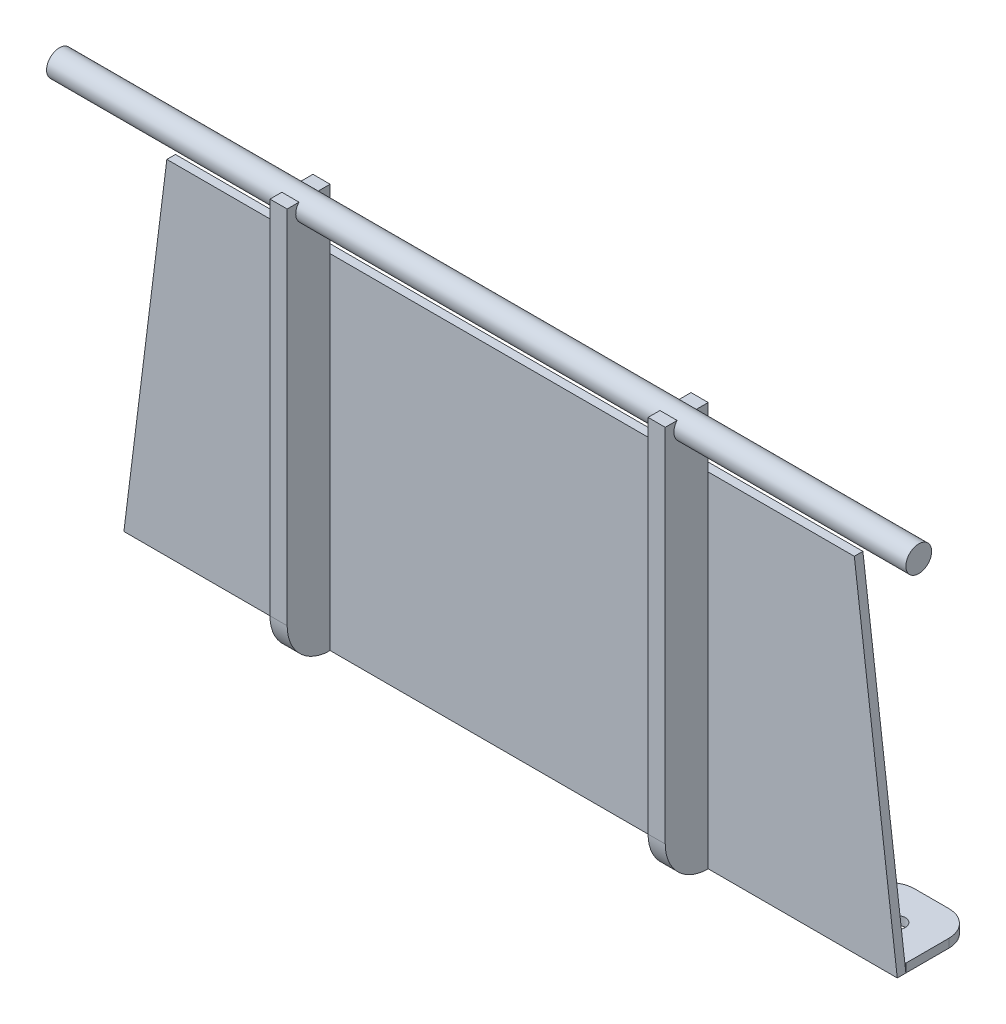
ISO-10303-21;
HEADER;
FILE_DESCRIPTION(('STEP AP214'),'2;1');
FILE_NAME('part.step','',(''),(''),'','','');
FILE_SCHEMA(('AUTOMOTIVE_DESIGN { 1 0 10303 214 1 1 1 1 }'));
ENDSEC;
DATA;
#1=APPLICATION_CONTEXT('core data for automotive mechanical design processes');
#2=APPLICATION_PROTOCOL_DEFINITION('international standard','automotive_design',2000,#1);
#3=PRODUCT_CONTEXT('',#1,'mechanical');
#4=PRODUCT('Part','Part','',(#3));
#5=PRODUCT_RELATED_PRODUCT_CATEGORY('part','',(#4));
#6=PRODUCT_DEFINITION_FORMATION('','',#4);
#7=PRODUCT_DEFINITION_CONTEXT('part definition',#1,'design');
#8=PRODUCT_DEFINITION('design','',#6,#7);
#9=PRODUCT_DEFINITION_SHAPE('','',#8);
#10=(LENGTH_UNIT() NAMED_UNIT(*) SI_UNIT(.MILLI.,.METRE.));
#11=(NAMED_UNIT(*) PLANE_ANGLE_UNIT() SI_UNIT($,.RADIAN.));
#12=(NAMED_UNIT(*) SI_UNIT($,.STERADIAN.) SOLID_ANGLE_UNIT());
#13=UNCERTAINTY_MEASURE_WITH_UNIT(LENGTH_MEASURE(1.E-05),#10,'distance_accuracy_value','');
#14=(GEOMETRIC_REPRESENTATION_CONTEXT(3) GLOBAL_UNCERTAINTY_ASSIGNED_CONTEXT((#13)) GLOBAL_UNIT_ASSIGNED_CONTEXT((#10,
#11,#12)) REPRESENTATION_CONTEXT('',''));
#15=CARTESIAN_POINT('',(0.,0.,0.));
#16=DIRECTION('',(0.,0.,1.));
#17=DIRECTION('',(1.,0.,0.));
#18=AXIS2_PLACEMENT_3D('',#15,#16,#17);
#19=CARTESIAN_POINT('',(0.,0.,0.));
#20=DIRECTION('',(0.,0.,1.));
#21=DIRECTION('',(1.,0.,0.));
#22=AXIS2_PLACEMENT_3D('',#19,#20,#21);
#23=PLANE('',#22);
#24=DIRECTION('',(-1.,0.,0.));
#25=VECTOR('',#24,1.);
#26=CARTESIAN_POINT('',(35.,1.,0.));
#27=LINE('',#26,#25);
#28=CARTESIAN_POINT('',(44.875,1.00000000000001,0.));
#29=VERTEX_POINT('',#28);
#30=CARTESIAN_POINT('',(35.,1.,0.));
#31=VERTEX_POINT('',#30);
#32=EDGE_CURVE('E249',#29,#31,#27,.T.);
#33=ORIENTED_EDGE('',*,*,#32,.T.);
#34=DIRECTION('',(0.,-1.,0.));
#35=VECTOR('',#34,1.);
#36=CARTESIAN_POINT('',(35.,1.,0.));
#37=LINE('',#36,#35);
#38=CARTESIAN_POINT('',(35.,0.,0.));
#39=VERTEX_POINT('',#38);
#40=EDGE_CURVE('E244',#31,#39,#37,.T.);
#41=ORIENTED_EDGE('',*,*,#40,.T.);
#42=DIRECTION('',(1.,0.,0.));
#43=VECTOR('',#42,1.);
#44=CARTESIAN_POINT('',(-45.,0.,0.));
#45=LINE('',#44,#43);
#46=CARTESIAN_POINT('',(-35.,0.,0.));
#47=VERTEX_POINT('',#46);
#48=EDGE_CURVE('E400',#47,#39,#45,.T.);
#49=ORIENTED_EDGE('',*,*,#48,.F.);
#50=DIRECTION('',(0.,-1.,0.));
#51=VECTOR('',#50,1.);
#52=CARTESIAN_POINT('',(-35.,1.,0.));
#53=LINE('',#52,#51);
#54=CARTESIAN_POINT('',(-35.,1.,0.));
#55=VERTEX_POINT('',#54);
#56=EDGE_CURVE('E299',#55,#47,#53,.T.);
#57=ORIENTED_EDGE('',*,*,#56,.F.);
#58=DIRECTION('',(1.,0.,0.));
#59=VECTOR('',#58,1.);
#60=CARTESIAN_POINT('',(-35.,1.,0.));
#61=LINE('',#60,#59);
#62=CARTESIAN_POINT('',(-44.875,1.,0.));
#63=VERTEX_POINT('',#62);
#64=EDGE_CURVE('E282',#63,#55,#61,.T.);
#65=ORIENTED_EDGE('',*,*,#64,.F.);
#66=DIRECTION('',(-0.124034734589208,-0.992277876713668,0.));
#67=VECTOR('',#66,1.);
#68=CARTESIAN_POINT('',(-40.,40.,0.));
#69=LINE('',#68,#67);
#70=CARTESIAN_POINT('',(-40.,40.,0.));
#71=VERTEX_POINT('',#70);
#72=EDGE_CURVE('E397',#71,#63,#69,.T.);
#73=ORIENTED_EDGE('',*,*,#72,.F.);
#74=DIRECTION('',(-1.,0.,0.));
#75=VECTOR('',#74,1.);
#76=CARTESIAN_POINT('',(40.,40.,0.));
#77=LINE('',#76,#75);
#78=CARTESIAN_POINT('',(40.,40.,0.));
#79=VERTEX_POINT('',#78);
#80=EDGE_CURVE('E385',#79,#71,#77,.T.);
#81=ORIENTED_EDGE('',*,*,#80,.F.);
#82=DIRECTION('',(-0.124034734589208,0.992277876713668,0.));
#83=VECTOR('',#82,1.);
#84=CARTESIAN_POINT('',(40.,40.,0.));
#85=LINE('',#84,#83);
#86=EDGE_CURVE('E403',#29,#79,#85,.T.);
#87=ORIENTED_EDGE('',*,*,#86,.F.);
#88=EDGE_LOOP('',(#33,#41,#49,#57,#65,#73,#81,#87));
#89=FACE_BOUND('',#88,.T.);
#90=ADVANCED_FACE('F33',(#89),#23,.F.);
#91=CARTESIAN_POINT('',(23.,47.,1.00000000000001));
#92=DIRECTION('',(0.,-1.,0.));
#93=DIRECTION('',(0.,0.,-1.));
#94=AXIS2_PLACEMENT_3D('',#91,#92,#93);
#95=PLANE('',#94);
#96=DIRECTION('',(0.,0.,1.));
#97=VECTOR('',#96,1.);
#98=CARTESIAN_POINT('',(21.,47.,1.00000000000001));
#99=LINE('',#98,#97);
#100=CARTESIAN_POINT('',(21.,47.,1.00000000000001));
#101=VERTEX_POINT('',#100);
#102=CARTESIAN_POINT('',(21.,47.,2.38196601125011));
#103=VERTEX_POINT('',#102);
#104=EDGE_CURVE('E369',#101,#103,#99,.T.);
#105=ORIENTED_EDGE('',*,*,#104,.T.);
#106=DIRECTION('',(1.,0.,0.));
#107=VECTOR('',#106,1.);
#108=CARTESIAN_POINT('',(-50.,47.,2.38196601125011));
#109=LINE('',#108,#107);
#110=CARTESIAN_POINT('',(23.,47.,2.38196601125011));
#111=VERTEX_POINT('',#110);
#112=EDGE_CURVE('E322',#103,#111,#109,.T.);
#113=ORIENTED_EDGE('',*,*,#112,.T.);
#114=DIRECTION('',(0.,0.,1.));
#115=VECTOR('',#114,1.);
#116=CARTESIAN_POINT('',(23.,47.,1.00000000000001));
#117=LINE('',#116,#115);
#118=CARTESIAN_POINT('',(23.,47.,1.00000000000001));
#119=VERTEX_POINT('',#118);
#120=EDGE_CURVE('E359',#119,#111,#117,.T.);
#121=ORIENTED_EDGE('',*,*,#120,.F.);
#122=DIRECTION('',(-1.,0.,0.));
#123=VECTOR('',#122,1.);
#124=CARTESIAN_POINT('',(23.,47.,1.00000000000001));
#125=LINE('',#124,#123);
#126=EDGE_CURVE('E377',#119,#101,#125,.T.);
#127=ORIENTED_EDGE('',*,*,#126,.T.);
#128=EDGE_LOOP('',(#105,#113,#121,#127));
#129=FACE_BOUND('',#128,.T.);
#130=ADVANCED_FACE('F518',(#129),#95,.F.);
#131=CARTESIAN_POINT('',(-23.,47.,1.00000000000001));
#132=DIRECTION('',(0.,1.,0.));
#133=DIRECTION('',(0.,0.,1.));
#134=AXIS2_PLACEMENT_3D('',#131,#132,#133);
#135=PLANE('',#134);
#136=DIRECTION('',(1.,0.,0.));
#137=VECTOR('',#136,1.);
#138=CARTESIAN_POINT('',(-50.,47.,4.6180339887499));
#139=LINE('',#138,#137);
#140=CARTESIAN_POINT('',(-23.,47.,4.6180339887499));
#141=VERTEX_POINT('',#140);
#142=CARTESIAN_POINT('',(-21.,47.,4.6180339887499));
#143=VERTEX_POINT('',#142);
#144=EDGE_CURVE('E311',#141,#143,#139,.T.);
#145=ORIENTED_EDGE('',*,*,#144,.F.);
#146=DIRECTION('',(0.,0.,1.));
#147=VECTOR('',#146,1.);
#148=CARTESIAN_POINT('',(-23.,47.,1.00000000000001));
#149=LINE('',#148,#147);
#150=CARTESIAN_POINT('',(-23.,47.,6.));
#151=VERTEX_POINT('',#150);
#152=EDGE_CURVE('E330',#141,#151,#149,.T.);
#153=ORIENTED_EDGE('',*,*,#152,.T.);
#154=DIRECTION('',(1.,0.,0.));
#155=VECTOR('',#154,1.);
#156=CARTESIAN_POINT('',(-23.,47.,6.));
#157=LINE('',#156,#155);
#158=CARTESIAN_POINT('',(-21.,47.,6.));
#159=VERTEX_POINT('',#158);
#160=EDGE_CURVE('E350',#151,#159,#157,.T.);
#161=ORIENTED_EDGE('',*,*,#160,.T.);
#162=DIRECTION('',(0.,0.,1.));
#163=VECTOR('',#162,1.);
#164=CARTESIAN_POINT('',(-21.,47.,1.00000000000001));
#165=LINE('',#164,#163);
#166=EDGE_CURVE('E342',#143,#159,#165,.T.);
#167=ORIENTED_EDGE('',*,*,#166,.F.);
#168=EDGE_LOOP('',(#145,#153,#161,#167));
#169=FACE_BOUND('',#168,.T.);
#170=ADVANCED_FACE('F550',(#169),#135,.T.);
#171=CARTESIAN_POINT('',(0.,0.,1.));
#172=DIRECTION('',(0.,0.,1.));
#173=DIRECTION('',(1.,0.,0.));
#174=AXIS2_PLACEMENT_3D('',#171,#172,#173);
#175=PLANE('',#174);
#176=DIRECTION('',(1.,0.,0.));
#177=VECTOR('',#176,1.);
#178=CARTESIAN_POINT('',(-45.,0.,1.));
#179=LINE('',#178,#177);
#180=CARTESIAN_POINT('',(-45.,0.,1.));
#181=VERTEX_POINT('',#180);
#182=CARTESIAN_POINT('',(-23.,0.,1.));
#183=VERTEX_POINT('',#182);
#184=EDGE_CURVE('E386',#181,#183,#179,.T.);
#185=ORIENTED_EDGE('',*,*,#184,.T.);
#186=DIRECTION('',(0.,1.,0.));
#187=VECTOR('',#186,1.);
#188=CARTESIAN_POINT('',(-23.,47.,1.00000000000001));
#189=LINE('',#188,#187);
#190=CARTESIAN_POINT('',(-23.,40.,1.00000000000001));
#191=VERTEX_POINT('',#190);
#192=EDGE_CURVE('E336',#183,#191,#189,.T.);
#193=ORIENTED_EDGE('',*,*,#192,.T.);
#194=DIRECTION('',(-1.,0.,0.));
#195=VECTOR('',#194,1.);
#196=CARTESIAN_POINT('',(40.,40.,1.));
#197=LINE('',#196,#195);
#198=CARTESIAN_POINT('',(-40.,40.,1.));
#199=VERTEX_POINT('',#198);
#200=EDGE_CURVE('E392',#191,#199,#197,.T.);
#201=ORIENTED_EDGE('',*,*,#200,.T.);
#202=DIRECTION('',(-0.124034734589208,-0.992277876713668,0.));
#203=VECTOR('',#202,1.);
#204=CARTESIAN_POINT('',(-40.,40.,1.));
#205=LINE('',#204,#203);
#206=EDGE_CURVE('E381',#199,#181,#205,.T.);
#207=ORIENTED_EDGE('',*,*,#206,.T.);
#208=EDGE_LOOP('',(#185,#193,#201,#207));
#209=FACE_BOUND('',#208,.T.);
#210=ADVANCED_FACE('F815',(#209),#175,.T.);
#211=DIRECTION('',(0.,1.,0.));
#212=VECTOR('',#211,1.);
#213=CARTESIAN_POINT('',(-21.,47.,1.00000000000001));
#214=LINE('',#213,#212);
#215=CARTESIAN_POINT('',(-21.,0.,1.));
#216=VERTEX_POINT('',#215);
#217=CARTESIAN_POINT('',(-21.,40.,1.));
#218=VERTEX_POINT('',#217);
#219=EDGE_CURVE('E331',#216,#218,#214,.T.);
#220=ORIENTED_EDGE('',*,*,#219,.F.);
#221=CARTESIAN_POINT('',(21.,0.,1.));
#222=VERTEX_POINT('',#221);
#223=EDGE_CURVE('E390',#216,#222,#179,.T.);
#224=ORIENTED_EDGE('',*,*,#223,.T.);
#225=DIRECTION('',(0.,1.,0.));
#226=VECTOR('',#225,1.);
#227=CARTESIAN_POINT('',(21.,47.,1.00000000000001));
#228=LINE('',#227,#226);
#229=CARTESIAN_POINT('',(21.,40.,1.));
#230=VERTEX_POINT('',#229);
#231=EDGE_CURVE('E366',#222,#230,#228,.T.);
#232=ORIENTED_EDGE('',*,*,#231,.T.);
#233=EDGE_CURVE('E818',#230,#218,#197,.T.);
#234=ORIENTED_EDGE('',*,*,#233,.T.);
#235=EDGE_LOOP('',(#220,#224,#232,#234));
#236=FACE_BOUND('',#235,.T.);
#237=ADVANCED_FACE('F497',(#236),#175,.T.);
#238=CARTESIAN_POINT('',(-40.,40.,1.));
#239=DIRECTION('',(0.992277876713668,-0.124034734589208,0.));
#240=DIRECTION('',(0.124034734589208,0.992277876713668,0.));
#241=AXIS2_PLACEMENT_3D('',#238,#239,#240);
#242=PLANE('',#241);
#243=ORIENTED_EDGE('',*,*,#72,.T.);
#244=CARTESIAN_POINT('',(-45.,0.,0.));
#245=VERTEX_POINT('',#244);
#246=EDGE_CURVE('E380',#63,#245,#69,.T.);
#247=ORIENTED_EDGE('',*,*,#246,.T.);
#248=DIRECTION('',(0.,0.,-1.));
#249=VECTOR('',#248,1.);
#250=CARTESIAN_POINT('',(-45.,0.,1.));
#251=LINE('',#250,#249);
#252=EDGE_CURVE('E413',#181,#245,#251,.T.);
#253=ORIENTED_EDGE('',*,*,#252,.F.);
#254=ORIENTED_EDGE('',*,*,#206,.F.);
#255=DIRECTION('',(0.,0.,-1.));
#256=VECTOR('',#255,1.);
#257=CARTESIAN_POINT('',(-40.,40.,1.));
#258=LINE('',#257,#256);
#259=EDGE_CURVE('E395',#199,#71,#258,.T.);
#260=ORIENTED_EDGE('',*,*,#259,.T.);
#261=EDGE_LOOP('',(#243,#247,#253,#254,#260));
#262=FACE_BOUND('',#261,.T.);
#263=ADVANCED_FACE('F562',(#262),#242,.F.);
#264=CARTESIAN_POINT('',(-45.,0.,1.));
#265=DIRECTION('',(0.,1.,0.));
#266=DIRECTION('',(-1.,0.,0.));
#267=AXIS2_PLACEMENT_3D('',#264,#265,#266);
#268=PLANE('',#267);
#269=CARTESIAN_POINT('',(40.3768398282202,0.,-3.56066017177982));
#270=DIRECTION('',(0.,-1.,0.));
#271=DIRECTION('',(0.,0.,1.));
#272=AXIS2_PLACEMENT_3D('',#269,#270,#271);
#273=CIRCLE('',#272,0.999999999999998);
#274=CARTESIAN_POINT('',(40.3768398282202,0.,-2.56066017177982));
#275=VERTEX_POINT('',#274);
#276=EDGE_CURVE('E264',#275,#275,#273,.T.);
#277=ORIENTED_EDGE('',*,*,#276,.F.);
#278=EDGE_LOOP('',(#277));
#279=FACE_BOUND('',#278,.T.);
#280=CARTESIAN_POINT('',(-40.3768398282202,0.,-3.56066017177982));
#281=DIRECTION('',(0.,1.,0.));
#282=DIRECTION('',(0.,0.,1.));
#283=AXIS2_PLACEMENT_3D('',#280,#281,#282);
#284=CIRCLE('',#283,0.999999999999998);
#285=CARTESIAN_POINT('',(-40.3768398282202,0.,-2.56066017177982));
#286=VERTEX_POINT('',#285);
#287=EDGE_CURVE('E271',#286,#286,#284,.T.);
#288=ORIENTED_EDGE('',*,*,#287,.T.);
#289=EDGE_LOOP('',(#288));
#290=FACE_BOUND('',#289,.T.);
#291=DIRECTION('',(0.,0.,-1.));
#292=VECTOR('',#291,1.);
#293=CARTESIAN_POINT('',(35.,0.,-8.));
#294=LINE('',#293,#292);
#295=CARTESIAN_POINT('',(35.,0.,-5.));
#296=VERTEX_POINT('',#295);
#297=EDGE_CURVE('E252',#39,#296,#294,.T.);
#298=ORIENTED_EDGE('',*,*,#297,.T.);
#299=CARTESIAN_POINT('',(38.,0.,-5.));
#300=DIRECTION('',(0.,1.,0.));
#301=DIRECTION('',(-1.,0.,0.));
#302=AXIS2_PLACEMENT_3D('',#299,#300,#301);
#303=CIRCLE('',#302,3.);
#304=CARTESIAN_POINT('',(38.,0.,-8.));
#305=VERTEX_POINT('',#304);
#306=EDGE_CURVE('E460',#296,#305,#303,.F.);
#307=ORIENTED_EDGE('',*,*,#306,.T.);
#308=DIRECTION('',(1.,0.,0.));
#309=VECTOR('',#308,1.);
#310=CARTESIAN_POINT('',(45.,0.,-8.));
#311=LINE('',#310,#309);
#312=CARTESIAN_POINT('',(42.,0.,-8.));
#313=VERTEX_POINT('',#312);
#314=EDGE_CURVE('E263',#305,#313,#311,.T.);
#315=ORIENTED_EDGE('',*,*,#314,.T.);
#316=CARTESIAN_POINT('',(42.,0.,-5.));
#317=DIRECTION('',(0.,1.,0.));
#318=DIRECTION('',(-1.,0.,0.));
#319=AXIS2_PLACEMENT_3D('',#316,#317,#318);
#320=CIRCLE('',#319,3.);
#321=CARTESIAN_POINT('',(45.,0.,-5.));
#322=VERTEX_POINT('',#321);
#323=EDGE_CURVE('E458',#313,#322,#320,.F.);
#324=ORIENTED_EDGE('',*,*,#323,.T.);
#325=DIRECTION('',(0.,0.,1.));
#326=VECTOR('',#325,1.);
#327=CARTESIAN_POINT('',(45.,0.,0.));
#328=LINE('',#327,#326);
#329=CARTESIAN_POINT('',(45.,0.,0.));
#330=VERTEX_POINT('',#329);
#331=EDGE_CURVE('E261',#322,#330,#328,.T.);
#332=ORIENTED_EDGE('',*,*,#331,.T.);
#333=DIRECTION('',(0.,0.,-1.));
#334=VECTOR('',#333,1.);
#335=CARTESIAN_POINT('',(45.,0.,1.));
#336=LINE('',#335,#334);
#337=CARTESIAN_POINT('',(45.,0.,1.));
#338=VERTEX_POINT('',#337);
#339=EDGE_CURVE('E411',#338,#330,#336,.T.);
#340=ORIENTED_EDGE('',*,*,#339,.F.);
#341=CARTESIAN_POINT('',(23.,0.,1.));
#342=VERTEX_POINT('',#341);
#343=EDGE_CURVE('E384',#342,#338,#179,.T.);
#344=ORIENTED_EDGE('',*,*,#343,.F.);
#345=DIRECTION('',(-1.,0.,0.));
#346=VECTOR('',#345,1.);
#347=CARTESIAN_POINT('',(-45.,0.,1.));
#348=LINE('',#347,#346);
#349=EDGE_CURVE('E416',#342,#222,#348,.T.);
#350=ORIENTED_EDGE('',*,*,#349,.T.);
#351=ORIENTED_EDGE('',*,*,#223,.F.);
#352=DIRECTION('',(1.,0.,0.));
#353=VECTOR('',#352,1.);
#354=CARTESIAN_POINT('',(-23.,0.,1.));
#355=LINE('',#354,#353);
#356=EDGE_CURVE('E430',#216,#183,#355,.F.);
#357=ORIENTED_EDGE('',*,*,#356,.T.);
#358=ORIENTED_EDGE('',*,*,#184,.F.);
#359=ORIENTED_EDGE('',*,*,#252,.T.);
#360=DIRECTION('',(0.,0.,1.));
#361=VECTOR('',#360,1.);
#362=CARTESIAN_POINT('',(-45.,0.,0.));
#363=LINE('',#362,#361);
#364=CARTESIAN_POINT('',(-45.,0.,-5.));
#365=VERTEX_POINT('',#364);
#366=EDGE_CURVE('E281',#365,#245,#363,.T.);
#367=ORIENTED_EDGE('',*,*,#366,.F.);
#368=CARTESIAN_POINT('',(-42.,0.,-5.));
#369=DIRECTION('',(0.,1.,0.));
#370=DIRECTION('',(-1.,0.,0.));
#371=AXIS2_PLACEMENT_3D('',#368,#369,#370);
#372=CIRCLE('',#371,3.);
#373=CARTESIAN_POINT('',(-42.,0.,-8.));
#374=VERTEX_POINT('',#373);
#375=EDGE_CURVE('E442',#365,#374,#372,.F.);
#376=ORIENTED_EDGE('',*,*,#375,.T.);
#377=DIRECTION('',(-1.,0.,0.));
#378=VECTOR('',#377,1.);
#379=CARTESIAN_POINT('',(-45.,0.,-8.));
#380=LINE('',#379,#378);
#381=CARTESIAN_POINT('',(-38.,0.,-8.));
#382=VERTEX_POINT('',#381);
#383=EDGE_CURVE('E293',#382,#374,#380,.T.);
#384=ORIENTED_EDGE('',*,*,#383,.F.);
#385=CARTESIAN_POINT('',(-38.,0.,-5.));
#386=DIRECTION('',(0.,1.,0.));
#387=DIRECTION('',(-1.,0.,0.));
#388=AXIS2_PLACEMENT_3D('',#385,#386,#387);
#389=CIRCLE('',#388,3.);
#390=CARTESIAN_POINT('',(-35.,0.,-5.));
#391=VERTEX_POINT('',#390);
#392=EDGE_CURVE('E444',#382,#391,#389,.F.);
#393=ORIENTED_EDGE('',*,*,#392,.T.);
#394=DIRECTION('',(0.,0.,-1.));
#395=VECTOR('',#394,1.);
#396=CARTESIAN_POINT('',(-35.,0.,-8.));
#397=LINE('',#396,#395);
#398=EDGE_CURVE('E274',#47,#391,#397,.T.);
#399=ORIENTED_EDGE('',*,*,#398,.F.);
#400=ORIENTED_EDGE('',*,*,#48,.T.);
#401=EDGE_LOOP('',(#298,#307,#315,#324,#332,#340,#344,#350,#351,#357,#358,#359,#367,#376,#384,
#393,#399,#400));
#402=FACE_BOUND('',#401,.T.);
#403=ADVANCED_FACE('F476',(#279,#290,#402),#268,.F.);
#404=CARTESIAN_POINT('',(40.,40.,1.));
#405=DIRECTION('',(-0.992277876713668,-0.124034734589208,0.));
#406=DIRECTION('',(0.124034734589208,-0.992277876713668,0.));
#407=AXIS2_PLACEMENT_3D('',#404,#405,#406);
#408=PLANE('',#407);
#409=EDGE_CURVE('E242',#330,#29,#85,.T.);
#410=ORIENTED_EDGE('',*,*,#409,.T.);
#411=ORIENTED_EDGE('',*,*,#86,.T.);
#412=DIRECTION('',(0.,0.,-1.));
#413=VECTOR('',#412,1.);
#414=CARTESIAN_POINT('',(40.,40.,1.));
#415=LINE('',#414,#413);
#416=CARTESIAN_POINT('',(40.,40.,1.));
#417=VERTEX_POINT('',#416);
#418=EDGE_CURVE('E408',#417,#79,#415,.T.);
#419=ORIENTED_EDGE('',*,*,#418,.F.);
#420=DIRECTION('',(-0.124034734589208,0.992277876713668,0.));
#421=VECTOR('',#420,1.);
#422=CARTESIAN_POINT('',(40.,40.,1.));
#423=LINE('',#422,#421);
#424=EDGE_CURVE('E389',#338,#417,#423,.T.);
#425=ORIENTED_EDGE('',*,*,#424,.F.);
#426=ORIENTED_EDGE('',*,*,#339,.T.);
#427=EDGE_LOOP('',(#410,#411,#419,#425,#426));
#428=FACE_BOUND('',#427,.T.);
#429=ADVANCED_FACE('F487',(#428),#408,.F.);
#430=CARTESIAN_POINT('',(40.,40.,1.));
#431=DIRECTION('',(0.,-1.,0.));
#432=DIRECTION('',(1.,0.,0.));
#433=AXIS2_PLACEMENT_3D('',#430,#431,#432);
#434=PLANE('',#433);
#435=ORIENTED_EDGE('',*,*,#80,.T.);
#436=ORIENTED_EDGE('',*,*,#259,.F.);
#437=ORIENTED_EDGE('',*,*,#200,.F.);
#438=EDGE_CURVE('E819',#218,#191,#197,.T.);
#439=ORIENTED_EDGE('',*,*,#438,.F.);
#440=ORIENTED_EDGE('',*,*,#233,.F.);
#441=CARTESIAN_POINT('',(23.,40.,1.00000000000001));
#442=VERTEX_POINT('',#441);
#443=EDGE_CURVE('E396',#442,#230,#197,.T.);
#444=ORIENTED_EDGE('',*,*,#443,.F.);
#445=EDGE_CURVE('E393',#417,#442,#197,.T.);
#446=ORIENTED_EDGE('',*,*,#445,.F.);
#447=ORIENTED_EDGE('',*,*,#418,.T.);
#448=EDGE_LOOP('',(#435,#436,#437,#439,#440,#444,#446,#447));
#449=FACE_BOUND('',#448,.T.);
#450=ADVANCED_FACE('F554',(#449),#434,.F.);
#451=DIRECTION('',(0.,1.,0.));
#452=VECTOR('',#451,1.);
#453=CARTESIAN_POINT('',(23.,47.,1.00000000000001));
#454=LINE('',#453,#452);
#455=EDGE_CURVE('E354',#342,#442,#454,.T.);
#456=ORIENTED_EDGE('',*,*,#455,.F.);
#457=ORIENTED_EDGE('',*,*,#343,.T.);
#458=ORIENTED_EDGE('',*,*,#424,.T.);
#459=ORIENTED_EDGE('',*,*,#445,.T.);
#460=EDGE_LOOP('',(#456,#457,#458,#459));
#461=FACE_BOUND('',#460,.T.);
#462=ADVANCED_FACE('F491',(#461),#175,.T.);
#463=CARTESIAN_POINT('',(23.,47.,1.00000000000001));
#464=DIRECTION('',(0.,0.,1.));
#465=DIRECTION('',(0.,-1.,0.));
#466=AXIS2_PLACEMENT_3D('',#463,#464,#465);
#467=PLANE('',#466);
#468=EDGE_CURVE('E358',#442,#119,#454,.T.);
#469=ORIENTED_EDGE('',*,*,#468,.F.);
#470=ORIENTED_EDGE('',*,*,#443,.T.);
#471=EDGE_CURVE('E353',#230,#101,#228,.T.);
#472=ORIENTED_EDGE('',*,*,#471,.T.);
#473=ORIENTED_EDGE('',*,*,#126,.F.);
#474=EDGE_LOOP('',(#469,#470,#472,#473));
#475=FACE_BOUND('',#474,.T.);
#476=ADVANCED_FACE('F515',(#475),#467,.F.);
#477=CARTESIAN_POINT('',(23.,47.,4.6180339887499));
#478=VERTEX_POINT('',#477);
#479=CARTESIAN_POINT('',(23.,47.,6.));
#480=VERTEX_POINT('',#479);
#481=EDGE_CURVE('E357',#478,#480,#117,.T.);
#482=ORIENTED_EDGE('',*,*,#481,.F.);
#483=DIRECTION('',(1.,0.,0.));
#484=VECTOR('',#483,1.);
#485=CARTESIAN_POINT('',(-50.,47.,4.6180339887499));
#486=LINE('',#485,#484);
#487=CARTESIAN_POINT('',(21.,47.,4.6180339887499));
#488=VERTEX_POINT('',#487);
#489=EDGE_CURVE('E319',#478,#488,#486,.F.);
#490=ORIENTED_EDGE('',*,*,#489,.T.);
#491=CARTESIAN_POINT('',(21.,47.,6.));
#492=VERTEX_POINT('',#491);
#493=EDGE_CURVE('E368',#488,#492,#99,.T.);
#494=ORIENTED_EDGE('',*,*,#493,.T.);
#495=DIRECTION('',(-1.,0.,0.));
#496=VECTOR('',#495,1.);
#497=CARTESIAN_POINT('',(23.,47.,6.));
#498=LINE('',#497,#496);
#499=EDGE_CURVE('E365',#480,#492,#498,.T.);
#500=ORIENTED_EDGE('',*,*,#499,.F.);
#501=EDGE_LOOP('',(#482,#490,#494,#500));
#502=FACE_BOUND('',#501,.T.);
#503=ADVANCED_FACE('F528',(#502),#95,.F.);
#504=CARTESIAN_POINT('',(23.,0.,6.));
#505=DIRECTION('',(0.,0.,-1.));
#506=DIRECTION('',(-1.,0.,0.));
#507=AXIS2_PLACEMENT_3D('',#504,#505,#506);
#508=PLANE('',#507);
#509=DIRECTION('',(0.,-1.,0.));
#510=VECTOR('',#509,1.);
#511=CARTESIAN_POINT('',(21.,0.,6.));
#512=LINE('',#511,#510);
#513=CARTESIAN_POINT('',(21.,5.00000000000001,6.));
#514=VERTEX_POINT('',#513);
#515=EDGE_CURVE('E372',#492,#514,#512,.T.);
#516=ORIENTED_EDGE('',*,*,#515,.T.);
#517=DIRECTION('',(-1.,0.,0.));
#518=VECTOR('',#517,1.);
#519=CARTESIAN_POINT('',(23.,5.00000000000001,6.));
#520=LINE('',#519,#518);
#521=CARTESIAN_POINT('',(23.,5.00000000000001,6.));
#522=VERTEX_POINT('',#521);
#523=EDGE_CURVE('E421',#514,#522,#520,.F.);
#524=ORIENTED_EDGE('',*,*,#523,.T.);
#525=DIRECTION('',(0.,-1.,0.));
#526=VECTOR('',#525,1.);
#527=CARTESIAN_POINT('',(23.,0.,6.));
#528=LINE('',#527,#526);
#529=EDGE_CURVE('E362',#480,#522,#528,.T.);
#530=ORIENTED_EDGE('',*,*,#529,.F.);
#531=ORIENTED_EDGE('',*,*,#499,.T.);
#532=EDGE_LOOP('',(#516,#524,#530,#531));
#533=FACE_BOUND('',#532,.T.);
#534=ADVANCED_FACE('F532',(#533),#508,.F.);
#535=CARTESIAN_POINT('',(23.,0.,0.));
#536=DIRECTION('',(-1.,0.,0.));
#537=DIRECTION('',(0.,0.,1.));
#538=AXIS2_PLACEMENT_3D('',#535,#536,#537);
#539=PLANE('',#538);
#540=ORIENTED_EDGE('',*,*,#120,.T.);
#541=CARTESIAN_POINT('',(23.,46.,3.5));
#542=DIRECTION('',(-1.,0.,0.));
#543=DIRECTION('',(0.,0.,1.));
#544=AXIS2_PLACEMENT_3D('',#541,#542,#543);
#545=CIRCLE('',#544,1.5);
#546=EDGE_CURVE('E324',#111,#478,#545,.T.);
#547=ORIENTED_EDGE('',*,*,#546,.T.);
#548=ORIENTED_EDGE('',*,*,#481,.T.);
#549=ORIENTED_EDGE('',*,*,#529,.T.);
#550=CARTESIAN_POINT('',(23.,5.00000000000001,1.));
#551=DIRECTION('',(-1.,0.,0.));
#552=DIRECTION('',(0.,0.,1.));
#553=AXIS2_PLACEMENT_3D('',#550,#551,#552);
#554=CIRCLE('',#553,5.);
#555=EDGE_CURVE('E423',#522,#342,#554,.F.);
#556=ORIENTED_EDGE('',*,*,#555,.T.);
#557=ORIENTED_EDGE('',*,*,#455,.T.);
#558=ORIENTED_EDGE('',*,*,#468,.T.);
#559=EDGE_LOOP('',(#540,#547,#548,#549,#556,#557,#558));
#560=FACE_BOUND('',#559,.T.);
#561=ADVANCED_FACE('F522',(#560),#539,.F.);
#562=CARTESIAN_POINT('',(21.,0.,0.));
#563=DIRECTION('',(-1.,0.,0.));
#564=DIRECTION('',(0.,0.,1.));
#565=AXIS2_PLACEMENT_3D('',#562,#563,#564);
#566=PLANE('',#565);
#567=CARTESIAN_POINT('',(21.,46.,3.5));
#568=DIRECTION('',(-1.,0.,0.));
#569=DIRECTION('',(0.,0.,1.));
#570=AXIS2_PLACEMENT_3D('',#567,#568,#569);
#571=CIRCLE('',#570,1.5);
#572=EDGE_CURVE('E316',#103,#488,#571,.T.);
#573=ORIENTED_EDGE('',*,*,#572,.F.);
#574=ORIENTED_EDGE('',*,*,#104,.F.);
#575=ORIENTED_EDGE('',*,*,#471,.F.);
#576=ORIENTED_EDGE('',*,*,#231,.F.);
#577=CARTESIAN_POINT('',(21.,5.00000000000001,1.));
#578=DIRECTION('',(-1.,0.,0.));
#579=DIRECTION('',(0.,0.,1.));
#580=AXIS2_PLACEMENT_3D('',#577,#578,#579);
#581=CIRCLE('',#580,5.);
#582=EDGE_CURVE('E419',#222,#514,#581,.T.);
#583=ORIENTED_EDGE('',*,*,#582,.T.);
#584=ORIENTED_EDGE('',*,*,#515,.F.);
#585=ORIENTED_EDGE('',*,*,#493,.F.);
#586=EDGE_LOOP('',(#573,#574,#575,#576,#583,#584,#585));
#587=FACE_BOUND('',#586,.T.);
#588=ADVANCED_FACE('F509',(#587),#566,.T.);
#589=CARTESIAN_POINT('',(-45.,5.,1.));
#590=DIRECTION('',(-1.,0.,0.));
#591=DIRECTION('',(0.,-1.,0.));
#592=AXIS2_PLACEMENT_3D('',#589,#590,#591);
#593=CYLINDRICAL_SURFACE('',#592,5.);
#594=ORIENTED_EDGE('',*,*,#555,.F.);
#595=ORIENTED_EDGE('',*,*,#523,.F.);
#596=ORIENTED_EDGE('',*,*,#582,.F.);
#597=ORIENTED_EDGE('',*,*,#349,.F.);
#598=EDGE_LOOP('',(#594,#595,#596,#597));
#599=FACE_BOUND('',#598,.T.);
#600=ADVANCED_FACE('F505',(#599),#593,.T.);
#601=CARTESIAN_POINT('',(-23.,47.,1.00000000000001));
#602=DIRECTION('',(0.,0.,-1.));
#603=DIRECTION('',(0.,1.,0.));
#604=AXIS2_PLACEMENT_3D('',#601,#602,#603);
#605=PLANE('',#604);
#606=ORIENTED_EDGE('',*,*,#438,.T.);
#607=CARTESIAN_POINT('',(-23.,47.,1.00000000000001));
#608=VERTEX_POINT('',#607);
#609=EDGE_CURVE('E335',#191,#608,#189,.T.);
#610=ORIENTED_EDGE('',*,*,#609,.T.);
#611=DIRECTION('',(1.,0.,0.));
#612=VECTOR('',#611,1.);
#613=CARTESIAN_POINT('',(-23.,47.,1.00000000000001));
#614=LINE('',#613,#612);
#615=CARTESIAN_POINT('',(-21.,47.,1.00000000000001));
#616=VERTEX_POINT('',#615);
#617=EDGE_CURVE('E339',#608,#616,#614,.T.);
#618=ORIENTED_EDGE('',*,*,#617,.T.);
#619=EDGE_CURVE('E345',#218,#616,#214,.T.);
#620=ORIENTED_EDGE('',*,*,#619,.F.);
#621=EDGE_LOOP('',(#606,#610,#618,#620));
#622=FACE_BOUND('',#621,.T.);
#623=ADVANCED_FACE('F569',(#622),#605,.T.);
#624=CARTESIAN_POINT('',(-23.,0.,6.));
#625=DIRECTION('',(0.,0.,1.));
#626=DIRECTION('',(1.,0.,0.));
#627=AXIS2_PLACEMENT_3D('',#624,#625,#626);
#628=PLANE('',#627);
#629=DIRECTION('',(0.,-1.,0.));
#630=VECTOR('',#629,1.);
#631=CARTESIAN_POINT('',(-23.,0.,6.));
#632=LINE('',#631,#630);
#633=CARTESIAN_POINT('',(-23.,5.,6.));
#634=VERTEX_POINT('',#633);
#635=EDGE_CURVE('E327',#151,#634,#632,.T.);
#636=ORIENTED_EDGE('',*,*,#635,.T.);
#637=DIRECTION('',(1.,0.,0.));
#638=VECTOR('',#637,1.);
#639=CARTESIAN_POINT('',(-21.,5.,6.));
#640=LINE('',#639,#638);
#641=CARTESIAN_POINT('',(-21.,5.,6.));
#642=VERTEX_POINT('',#641);
#643=EDGE_CURVE('E425',#634,#642,#640,.T.);
#644=ORIENTED_EDGE('',*,*,#643,.T.);
#645=DIRECTION('',(0.,-1.,0.));
#646=VECTOR('',#645,1.);
#647=CARTESIAN_POINT('',(-21.,0.,6.));
#648=LINE('',#647,#646);
#649=EDGE_CURVE('E326',#159,#642,#648,.T.);
#650=ORIENTED_EDGE('',*,*,#649,.F.);
#651=ORIENTED_EDGE('',*,*,#160,.F.);
#652=EDGE_LOOP('',(#636,#644,#650,#651));
#653=FACE_BOUND('',#652,.T.);
#654=ADVANCED_FACE('F648',(#653),#628,.T.);
#655=DIRECTION('',(1.,0.,0.));
#656=VECTOR('',#655,1.);
#657=CARTESIAN_POINT('',(-50.,47.,2.38196601125011));
#658=LINE('',#657,#656);
#659=CARTESIAN_POINT('',(-21.,47.,2.38196601125011));
#660=VERTEX_POINT('',#659);
#661=CARTESIAN_POINT('',(-23.,47.,2.38196601125011));
#662=VERTEX_POINT('',#661);
#663=EDGE_CURVE('E306',#660,#662,#658,.F.);
#664=ORIENTED_EDGE('',*,*,#663,.F.);
#665=EDGE_CURVE('E343',#616,#660,#165,.T.);
#666=ORIENTED_EDGE('',*,*,#665,.F.);
#667=ORIENTED_EDGE('',*,*,#617,.F.);
#668=EDGE_CURVE('E332',#608,#662,#149,.T.);
#669=ORIENTED_EDGE('',*,*,#668,.T.);
#670=EDGE_LOOP('',(#664,#666,#667,#669));
#671=FACE_BOUND('',#670,.T.);
#672=ADVANCED_FACE('F641',(#671),#135,.T.);
#673=CARTESIAN_POINT('',(-23.,0.,0.));
#674=DIRECTION('',(1.,0.,0.));
#675=DIRECTION('',(0.,0.,1.));
#676=AXIS2_PLACEMENT_3D('',#673,#674,#675);
#677=PLANE('',#676);
#678=ORIENTED_EDGE('',*,*,#152,.F.);
#679=CARTESIAN_POINT('',(-23.,46.,3.5));
#680=DIRECTION('',(1.,0.,0.));
#681=DIRECTION('',(0.,0.,-1.));
#682=AXIS2_PLACEMENT_3D('',#679,#680,#681);
#683=CIRCLE('',#682,1.5);
#684=EDGE_CURVE('E314',#141,#662,#683,.T.);
#685=ORIENTED_EDGE('',*,*,#684,.T.);
#686=ORIENTED_EDGE('',*,*,#668,.F.);
#687=ORIENTED_EDGE('',*,*,#609,.F.);
#688=ORIENTED_EDGE('',*,*,#192,.F.);
#689=CARTESIAN_POINT('',(-23.,5.,1.));
#690=DIRECTION('',(1.,0.,0.));
#691=DIRECTION('',(0.,0.,-1.));
#692=AXIS2_PLACEMENT_3D('',#689,#690,#691);
#693=CIRCLE('',#692,5.);
#694=EDGE_CURVE('E432',#183,#634,#693,.F.);
#695=ORIENTED_EDGE('',*,*,#694,.T.);
#696=ORIENTED_EDGE('',*,*,#635,.F.);
#697=EDGE_LOOP('',(#678,#685,#686,#687,#688,#695,#696));
#698=FACE_BOUND('',#697,.T.);
#699=ADVANCED_FACE('F638',(#698),#677,.F.);
#700=CARTESIAN_POINT('',(-21.,0.,0.));
#701=DIRECTION('',(1.,0.,0.));
#702=DIRECTION('',(0.,0.,1.));
#703=AXIS2_PLACEMENT_3D('',#700,#701,#702);
#704=PLANE('',#703);
#705=CARTESIAN_POINT('',(-21.,46.,3.5));
#706=DIRECTION('',(1.,0.,0.));
#707=DIRECTION('',(0.,0.,-1.));
#708=AXIS2_PLACEMENT_3D('',#705,#706,#707);
#709=CIRCLE('',#708,1.5);
#710=EDGE_CURVE('E434',#143,#660,#709,.T.);
#711=ORIENTED_EDGE('',*,*,#710,.F.);
#712=ORIENTED_EDGE('',*,*,#166,.T.);
#713=ORIENTED_EDGE('',*,*,#649,.T.);
#714=CARTESIAN_POINT('',(-21.,5.,1.));
#715=DIRECTION('',(1.,0.,0.));
#716=DIRECTION('',(0.,0.,-1.));
#717=AXIS2_PLACEMENT_3D('',#714,#715,#716);
#718=CIRCLE('',#717,5.);
#719=EDGE_CURVE('E428',#642,#216,#718,.T.);
#720=ORIENTED_EDGE('',*,*,#719,.T.);
#721=ORIENTED_EDGE('',*,*,#219,.T.);
#722=ORIENTED_EDGE('',*,*,#619,.T.);
#723=ORIENTED_EDGE('',*,*,#665,.T.);
#724=EDGE_LOOP('',(#711,#712,#713,#720,#721,#722,#723));
#725=FACE_BOUND('',#724,.T.);
#726=ADVANCED_FACE('F573',(#725),#704,.T.);
#727=CARTESIAN_POINT('',(-23.,5.,1.));
#728=DIRECTION('',(-1.,0.,0.));
#729=DIRECTION('',(0.,-1.,0.));
#730=AXIS2_PLACEMENT_3D('',#727,#728,#729);
#731=CYLINDRICAL_SURFACE('',#730,5.);
#732=ORIENTED_EDGE('',*,*,#694,.F.);
#733=ORIENTED_EDGE('',*,*,#356,.F.);
#734=ORIENTED_EDGE('',*,*,#719,.F.);
#735=ORIENTED_EDGE('',*,*,#643,.F.);
#736=EDGE_LOOP('',(#732,#733,#734,#735));
#737=FACE_BOUND('',#736,.T.);
#738=ADVANCED_FACE('F570',(#737),#731,.T.);
#739=CARTESIAN_POINT('',(-50.,46.,3.5));
#740=DIRECTION('',(1.,0.,0.));
#741=DIRECTION('',(0.,0.,-1.));
#742=AXIS2_PLACEMENT_3D('',#739,#740,#741);
#743=CYLINDRICAL_SURFACE('',#742,1.5);
#744=ORIENTED_EDGE('',*,*,#684,.F.);
#745=ORIENTED_EDGE('',*,*,#144,.T.);
#746=ORIENTED_EDGE('',*,*,#710,.T.);
#747=ORIENTED_EDGE('',*,*,#663,.T.);
#748=EDGE_LOOP('',(#744,#745,#746,#747));
#749=FACE_BOUND('',#748,.T.);
#750=CARTESIAN_POINT('',(-50.,46.,3.5));
#751=DIRECTION('',(1.,0.,0.));
#752=DIRECTION('',(0.,0.,-1.));
#753=AXIS2_PLACEMENT_3D('',#750,#751,#752);
#754=CIRCLE('',#753,1.5);
#755=CARTESIAN_POINT('',(-50.,46.,2.));
#756=VERTEX_POINT('',#755);
#757=EDGE_CURVE('E303',#756,#756,#754,.T.);
#758=ORIENTED_EDGE('',*,*,#757,.T.);
#759=EDGE_LOOP('',(#758));
#760=FACE_BOUND('',#759,.T.);
#761=CARTESIAN_POINT('',(50.,46.,3.5));
#762=DIRECTION('',(1.,0.,0.));
#763=DIRECTION('',(0.,0.,-1.));
#764=AXIS2_PLACEMENT_3D('',#761,#762,#763);
#765=CIRCLE('',#764,1.5);
#766=CARTESIAN_POINT('',(50.,46.,2.));
#767=VERTEX_POINT('',#766);
#768=EDGE_CURVE('E302',#767,#767,#765,.T.);
#769=ORIENTED_EDGE('',*,*,#768,.F.);
#770=EDGE_LOOP('',(#769));
#771=FACE_BOUND('',#770,.T.);
#772=ORIENTED_EDGE('',*,*,#546,.F.);
#773=ORIENTED_EDGE('',*,*,#112,.F.);
#774=ORIENTED_EDGE('',*,*,#572,.T.);
#775=ORIENTED_EDGE('',*,*,#489,.F.);
#776=EDGE_LOOP('',(#772,#773,#774,#775));
#777=FACE_BOUND('',#776,.T.);
#778=ADVANCED_FACE('F526',(#749,#760,#771,#777),#743,.T.);
#779=CARTESIAN_POINT('',(-50.,46.,3.5));
#780=DIRECTION('',(1.,0.,0.));
#781=DIRECTION('',(0.,0.,-1.));
#782=AXIS2_PLACEMENT_3D('',#779,#780,#781);
#783=PLANE('',#782);
#784=ORIENTED_EDGE('',*,*,#757,.F.);
#785=EDGE_LOOP('',(#784));
#786=FACE_BOUND('',#785,.T.);
#787=ADVANCED_FACE('F628',(#786),#783,.F.);
#788=CARTESIAN_POINT('',(50.,46.,3.5));
#789=DIRECTION('',(1.,0.,0.));
#790=DIRECTION('',(0.,0.,-1.));
#791=AXIS2_PLACEMENT_3D('',#788,#789,#790);
#792=PLANE('',#791);
#793=ORIENTED_EDGE('',*,*,#768,.T.);
#794=EDGE_LOOP('',(#793));
#795=FACE_BOUND('',#794,.T.);
#796=ADVANCED_FACE('F626',(#795),#792,.T.);
#797=CARTESIAN_POINT('',(-35.,1.,0.));
#798=DIRECTION('',(0.,0.,-1.));
#799=DIRECTION('',(-1.,0.,0.));
#800=AXIS2_PLACEMENT_3D('',#797,#798,#799);
#801=PLANE('',#800);
#802=ORIENTED_EDGE('',*,*,#246,.F.);
#803=CARTESIAN_POINT('',(-45.,1.,0.));
#804=VERTEX_POINT('',#803);
#805=EDGE_CURVE('E277',#804,#63,#61,.T.);
#806=ORIENTED_EDGE('',*,*,#805,.F.);
#807=DIRECTION('',(0.,-1.,0.));
#808=VECTOR('',#807,1.);
#809=CARTESIAN_POINT('',(-45.,1.,0.));
#810=LINE('',#809,#808);
#811=EDGE_CURVE('E290',#804,#245,#810,.T.);
#812=ORIENTED_EDGE('',*,*,#811,.T.);
#813=EDGE_LOOP('',(#802,#806,#812));
#814=FACE_BOUND('',#813,.T.);
#815=ADVANCED_FACE('F622',(#814),#801,.F.);
#816=CARTESIAN_POINT('',(-35.,1.,-8.));
#817=DIRECTION('',(-1.,0.,0.));
#818=DIRECTION('',(0.,0.,1.));
#819=AXIS2_PLACEMENT_3D('',#816,#817,#818);
#820=PLANE('',#819);
#821=ORIENTED_EDGE('',*,*,#398,.T.);
#822=DIRECTION('',(0.,-1.,0.));
#823=VECTOR('',#822,1.);
#824=CARTESIAN_POINT('',(-35.,1.,-5.));
#825=LINE('',#824,#823);
#826=CARTESIAN_POINT('',(-35.,1.,-5.));
#827=VERTEX_POINT('',#826);
#828=EDGE_CURVE('E446',#391,#827,#825,.F.);
#829=ORIENTED_EDGE('',*,*,#828,.T.);
#830=DIRECTION('',(0.,0.,-1.));
#831=VECTOR('',#830,1.);
#832=CARTESIAN_POINT('',(-35.,1.,-8.));
#833=LINE('',#832,#831);
#834=EDGE_CURVE('E280',#55,#827,#833,.T.);
#835=ORIENTED_EDGE('',*,*,#834,.F.);
#836=ORIENTED_EDGE('',*,*,#56,.T.);
#837=EDGE_LOOP('',(#821,#829,#835,#836));
#838=FACE_BOUND('',#837,.T.);
#839=ADVANCED_FACE('F618',(#838),#820,.F.);
#840=CARTESIAN_POINT('',(-45.,1.,-8.));
#841=DIRECTION('',(0.,0.,1.));
#842=DIRECTION('',(1.,0.,0.));
#843=AXIS2_PLACEMENT_3D('',#840,#841,#842);
#844=PLANE('',#843);
#845=DIRECTION('',(-1.,0.,0.));
#846=VECTOR('',#845,1.);
#847=CARTESIAN_POINT('',(-45.,1.,-8.));
#848=LINE('',#847,#846);
#849=CARTESIAN_POINT('',(-38.,1.,-8.));
#850=VERTEX_POINT('',#849);
#851=CARTESIAN_POINT('',(-42.,1.,-8.));
#852=VERTEX_POINT('',#851);
#853=EDGE_CURVE('E285',#850,#852,#848,.T.);
#854=ORIENTED_EDGE('',*,*,#853,.F.);
#855=DIRECTION('',(0.,-1.,0.));
#856=VECTOR('',#855,1.);
#857=CARTESIAN_POINT('',(-38.,1.,-8.));
#858=LINE('',#857,#856);
#859=EDGE_CURVE('E439',#850,#382,#858,.T.);
#860=ORIENTED_EDGE('',*,*,#859,.T.);
#861=ORIENTED_EDGE('',*,*,#383,.T.);
#862=DIRECTION('',(0.,-1.,0.));
#863=VECTOR('',#862,1.);
#864=CARTESIAN_POINT('',(-42.,1.,-8.));
#865=LINE('',#864,#863);
#866=EDGE_CURVE('E437',#374,#852,#865,.F.);
#867=ORIENTED_EDGE('',*,*,#866,.T.);
#868=EDGE_LOOP('',(#854,#860,#861,#867));
#869=FACE_BOUND('',#868,.T.);
#870=ADVANCED_FACE('F614',(#869),#844,.F.);
#871=CARTESIAN_POINT('',(-45.,1.,0.));
#872=DIRECTION('',(1.,0.,0.));
#873=DIRECTION('',(0.,0.,-1.));
#874=AXIS2_PLACEMENT_3D('',#871,#872,#873);
#875=PLANE('',#874);
#876=DIRECTION('',(0.,0.,1.));
#877=VECTOR('',#876,1.);
#878=CARTESIAN_POINT('',(-45.,1.,0.));
#879=LINE('',#878,#877);
#880=CARTESIAN_POINT('',(-45.,1.,-5.));
#881=VERTEX_POINT('',#880);
#882=EDGE_CURVE('E288',#881,#804,#879,.T.);
#883=ORIENTED_EDGE('',*,*,#882,.F.);
#884=DIRECTION('',(0.,-1.,0.));
#885=VECTOR('',#884,1.);
#886=CARTESIAN_POINT('',(-45.,1.,-5.));
#887=LINE('',#886,#885);
#888=EDGE_CURVE('E452',#881,#365,#887,.T.);
#889=ORIENTED_EDGE('',*,*,#888,.T.);
#890=ORIENTED_EDGE('',*,*,#366,.T.);
#891=ORIENTED_EDGE('',*,*,#811,.F.);
#892=EDGE_LOOP('',(#883,#889,#890,#891));
#893=FACE_BOUND('',#892,.T.);
#894=ADVANCED_FACE('F610',(#893),#875,.F.);
#895=CARTESIAN_POINT('',(0.,1.,0.));
#896=DIRECTION('',(0.,-1.,0.));
#897=DIRECTION('',(0.,0.,-1.));
#898=AXIS2_PLACEMENT_3D('',#895,#896,#897);
#899=PLANE('',#898);
#900=CARTESIAN_POINT('',(-40.3768398282202,1.,-3.56066017177982));
#901=DIRECTION('',(0.,1.,0.));
#902=DIRECTION('',(0.,0.,1.));
#903=AXIS2_PLACEMENT_3D('',#900,#901,#902);
#904=CIRCLE('',#903,0.999999999999998);
#905=CARTESIAN_POINT('',(-40.3768398282202,1.,-2.56066017177982));
#906=VERTEX_POINT('',#905);
#907=EDGE_CURVE('E243',#906,#906,#904,.T.);
#908=ORIENTED_EDGE('',*,*,#907,.F.);
#909=EDGE_LOOP('',(#908));
#910=FACE_BOUND('',#909,.T.);
#911=ORIENTED_EDGE('',*,*,#834,.T.);
#912=CARTESIAN_POINT('',(-38.,1.,-5.));
#913=DIRECTION('',(0.,-1.,0.));
#914=DIRECTION('',(0.,0.,-1.));
#915=AXIS2_PLACEMENT_3D('',#912,#913,#914);
#916=CIRCLE('',#915,3.);
#917=EDGE_CURVE('E450',#827,#850,#916,.F.);
#918=ORIENTED_EDGE('',*,*,#917,.T.);
#919=ORIENTED_EDGE('',*,*,#853,.T.);
#920=CARTESIAN_POINT('',(-42.,1.,-5.));
#921=DIRECTION('',(0.,-1.,0.));
#922=DIRECTION('',(0.,0.,-1.));
#923=AXIS2_PLACEMENT_3D('',#920,#921,#922);
#924=CIRCLE('',#923,3.);
#925=EDGE_CURVE('E448',#852,#881,#924,.F.);
#926=ORIENTED_EDGE('',*,*,#925,.T.);
#927=ORIENTED_EDGE('',*,*,#882,.T.);
#928=ORIENTED_EDGE('',*,*,#805,.T.);
#929=ORIENTED_EDGE('',*,*,#64,.T.);
#930=EDGE_LOOP('',(#911,#918,#919,#926,#927,#928,#929));
#931=FACE_BOUND('',#930,.T.);
#932=ADVANCED_FACE('F579',(#910,#931),#899,.F.);
#933=CARTESIAN_POINT('',(-38.,1.,-5.));
#934=DIRECTION('',(0.,-1.,0.));
#935=DIRECTION('',(0.,0.,-1.));
#936=AXIS2_PLACEMENT_3D('',#933,#934,#935);
#937=CYLINDRICAL_SURFACE('',#936,3.);
#938=ORIENTED_EDGE('',*,*,#917,.F.);
#939=ORIENTED_EDGE('',*,*,#828,.F.);
#940=ORIENTED_EDGE('',*,*,#392,.F.);
#941=ORIENTED_EDGE('',*,*,#859,.F.);
#942=EDGE_LOOP('',(#938,#939,#940,#941));
#943=FACE_BOUND('',#942,.T.);
#944=ADVANCED_FACE('F575',(#943),#937,.T.);
#945=CARTESIAN_POINT('',(-42.,1.,-5.));
#946=DIRECTION('',(0.,-1.,0.));
#947=DIRECTION('',(0.,0.,-1.));
#948=AXIS2_PLACEMENT_3D('',#945,#946,#947);
#949=CYLINDRICAL_SURFACE('',#948,3.);
#950=ORIENTED_EDGE('',*,*,#925,.F.);
#951=ORIENTED_EDGE('',*,*,#866,.F.);
#952=ORIENTED_EDGE('',*,*,#375,.F.);
#953=ORIENTED_EDGE('',*,*,#888,.F.);
#954=EDGE_LOOP('',(#950,#951,#952,#953));
#955=FACE_BOUND('',#954,.T.);
#956=ADVANCED_FACE('F578',(#955),#949,.T.);
#957=CARTESIAN_POINT('',(-40.3768398282202,0.,-3.56066017177982));
#958=DIRECTION('',(0.,1.,0.));
#959=DIRECTION('',(0.,0.,1.));
#960=AXIS2_PLACEMENT_3D('',#957,#958,#959);
#961=CYLINDRICAL_SURFACE('',#960,0.999999999999998);
#962=ORIENTED_EDGE('',*,*,#287,.F.);
#963=EDGE_LOOP('',(#962));
#964=FACE_BOUND('',#963,.T.);
#965=ORIENTED_EDGE('',*,*,#907,.T.);
#966=EDGE_LOOP('',(#965));
#967=FACE_BOUND('',#966,.T.);
#968=ADVANCED_FACE('F582',(#964,#967),#961,.F.);
#969=CARTESIAN_POINT('',(35.,1.,0.));
#970=DIRECTION('',(0.,0.,1.));
#971=DIRECTION('',(1.,0.,0.));
#972=AXIS2_PLACEMENT_3D('',#969,#970,#971);
#973=PLANE('',#972);
#974=ORIENTED_EDGE('',*,*,#409,.F.);
#975=DIRECTION('',(0.,-1.,0.));
#976=VECTOR('',#975,1.);
#977=CARTESIAN_POINT('',(45.,1.,0.));
#978=LINE('',#977,#976);
#979=CARTESIAN_POINT('',(45.,1.,0.));
#980=VERTEX_POINT('',#979);
#981=EDGE_CURVE('E231',#980,#330,#978,.T.);
#982=ORIENTED_EDGE('',*,*,#981,.F.);
#983=EDGE_CURVE('E235',#980,#29,#27,.T.);
#984=ORIENTED_EDGE('',*,*,#983,.T.);
#985=EDGE_LOOP('',(#974,#982,#984));
#986=FACE_BOUND('',#985,.T.);
#987=ADVANCED_FACE('F239',(#986),#973,.T.);
#988=CARTESIAN_POINT('',(45.,1.,0.));
#989=DIRECTION('',(1.,0.,0.));
#990=DIRECTION('',(0.,0.,-1.));
#991=AXIS2_PLACEMENT_3D('',#988,#989,#990);
#992=PLANE('',#991);
#993=ORIENTED_EDGE('',*,*,#331,.F.);
#994=DIRECTION('',(0.,-1.,0.));
#995=VECTOR('',#994,1.);
#996=CARTESIAN_POINT('',(45.,1.,-5.));
#997=LINE('',#996,#995);
#998=CARTESIAN_POINT('',(45.,1.,-5.));
#999=VERTEX_POINT('',#998);
#1000=EDGE_CURVE('E11',#322,#999,#997,.F.);
#1001=ORIENTED_EDGE('',*,*,#1000,.T.);
#1002=DIRECTION('',(0.,0.,1.));
#1003=VECTOR('',#1002,1.);
#1004=CARTESIAN_POINT('',(45.,1.,0.));
#1005=LINE('',#1004,#1003);
#1006=EDGE_CURVE('E228',#999,#980,#1005,.T.);
#1007=ORIENTED_EDGE('',*,*,#1006,.T.);
#1008=ORIENTED_EDGE('',*,*,#981,.T.);
#1009=EDGE_LOOP('',(#993,#1001,#1007,#1008));
#1010=FACE_BOUND('',#1009,.T.);
#1011=ADVANCED_FACE('F230',(#1010),#992,.T.);
#1012=CARTESIAN_POINT('',(45.,1.,-8.));
#1013=DIRECTION('',(0.,0.,-1.));
#1014=DIRECTION('',(-1.,0.,0.));
#1015=AXIS2_PLACEMENT_3D('',#1012,#1013,#1014);
#1016=PLANE('',#1015);
#1017=ORIENTED_EDGE('',*,*,#314,.F.);
#1018=DIRECTION('',(0.,-1.,0.));
#1019=VECTOR('',#1018,1.);
#1020=CARTESIAN_POINT('',(38.,1.,-8.));
#1021=LINE('',#1020,#1019);
#1022=CARTESIAN_POINT('',(38.,1.,-8.));
#1023=VERTEX_POINT('',#1022);
#1024=EDGE_CURVE('E465',#305,#1023,#1021,.F.);
#1025=ORIENTED_EDGE('',*,*,#1024,.T.);
#1026=DIRECTION('',(1.,0.,0.));
#1027=VECTOR('',#1026,1.);
#1028=CARTESIAN_POINT('',(45.,1.,-8.));
#1029=LINE('',#1028,#1027);
#1030=CARTESIAN_POINT('',(42.,1.,-8.));
#1031=VERTEX_POINT('',#1030);
#1032=EDGE_CURVE('E234',#1023,#1031,#1029,.T.);
#1033=ORIENTED_EDGE('',*,*,#1032,.T.);
#1034=DIRECTION('',(0.,-1.,0.));
#1035=VECTOR('',#1034,1.);
#1036=CARTESIAN_POINT('',(42.,1.,-8.));
#1037=LINE('',#1036,#1035);
#1038=EDGE_CURVE('E462',#1031,#313,#1037,.T.);
#1039=ORIENTED_EDGE('',*,*,#1038,.T.);
#1040=EDGE_LOOP('',(#1017,#1025,#1033,#1039));
#1041=FACE_BOUND('',#1040,.T.);
#1042=ADVANCED_FACE('F478',(#1041),#1016,.T.);
#1043=CARTESIAN_POINT('',(35.,1.,-8.));
#1044=DIRECTION('',(-1.,0.,0.));
#1045=DIRECTION('',(0.,0.,1.));
#1046=AXIS2_PLACEMENT_3D('',#1043,#1044,#1045);
#1047=PLANE('',#1046);
#1048=DIRECTION('',(0.,0.,-1.));
#1049=VECTOR('',#1048,1.);
#1050=CARTESIAN_POINT('',(35.,1.,-8.));
#1051=LINE('',#1050,#1049);
#1052=CARTESIAN_POINT('',(35.,1.,-5.));
#1053=VERTEX_POINT('',#1052);
#1054=EDGE_CURVE('E258',#31,#1053,#1051,.T.);
#1055=ORIENTED_EDGE('',*,*,#1054,.T.);
#1056=DIRECTION('',(0.,-1.,0.));
#1057=VECTOR('',#1056,1.);
#1058=CARTESIAN_POINT('',(35.,1.,-5.));
#1059=LINE('',#1058,#1057);
#1060=EDGE_CURVE('E455',#1053,#296,#1059,.T.);
#1061=ORIENTED_EDGE('',*,*,#1060,.T.);
#1062=ORIENTED_EDGE('',*,*,#297,.F.);
#1063=ORIENTED_EDGE('',*,*,#40,.F.);
#1064=EDGE_LOOP('',(#1055,#1061,#1062,#1063));
#1065=FACE_BOUND('',#1064,.T.);
#1066=ADVANCED_FACE('F472',(#1065),#1047,.T.);
#1067=CARTESIAN_POINT('',(0.,1.,0.));
#1068=DIRECTION('',(0.,-1.,0.));
#1069=DIRECTION('',(0.,0.,-1.));
#1070=AXIS2_PLACEMENT_3D('',#1067,#1068,#1069);
#1071=PLANE('',#1070);
#1072=CARTESIAN_POINT('',(40.3768398282202,1.,-3.56066017177982));
#1073=DIRECTION('',(0.,-1.,0.));
#1074=DIRECTION('',(0.,0.,1.));
#1075=AXIS2_PLACEMENT_3D('',#1072,#1073,#1074);
#1076=CIRCLE('',#1075,0.999999999999998);
#1077=CARTESIAN_POINT('',(40.3768398282202,1.,-2.56066017177982));
#1078=VERTEX_POINT('',#1077);
#1079=EDGE_CURVE('E254',#1078,#1078,#1076,.T.);
#1080=ORIENTED_EDGE('',*,*,#1079,.T.);
#1081=EDGE_LOOP('',(#1080));
#1082=FACE_BOUND('',#1081,.T.);
#1083=ORIENTED_EDGE('',*,*,#1032,.F.);
#1084=CARTESIAN_POINT('',(38.,1.,-5.));
#1085=DIRECTION('',(0.,-1.,0.));
#1086=DIRECTION('',(0.,0.,-1.));
#1087=AXIS2_PLACEMENT_3D('',#1084,#1085,#1086);
#1088=CIRCLE('',#1087,3.);
#1089=EDGE_CURVE('E41',#1023,#1053,#1088,.F.);
#1090=ORIENTED_EDGE('',*,*,#1089,.T.);
#1091=ORIENTED_EDGE('',*,*,#1054,.F.);
#1092=ORIENTED_EDGE('',*,*,#32,.F.);
#1093=ORIENTED_EDGE('',*,*,#983,.F.);
#1094=ORIENTED_EDGE('',*,*,#1006,.F.);
#1095=CARTESIAN_POINT('',(42.,1.,-5.));
#1096=DIRECTION('',(0.,-1.,0.));
#1097=DIRECTION('',(0.,0.,-1.));
#1098=AXIS2_PLACEMENT_3D('',#1095,#1096,#1097);
#1099=CIRCLE('',#1098,3.);
#1100=EDGE_CURVE('E53',#999,#1031,#1099,.F.);
#1101=ORIENTED_EDGE('',*,*,#1100,.T.);
#1102=EDGE_LOOP('',(#1083,#1090,#1091,#1092,#1093,#1094,#1101));
#1103=FACE_BOUND('',#1102,.T.);
#1104=ADVANCED_FACE('F246',(#1082,#1103),#1071,.F.);
#1105=CARTESIAN_POINT('',(38.,1.,-5.));
#1106=DIRECTION('',(0.,-1.,0.));
#1107=DIRECTION('',(0.,0.,-1.));
#1108=AXIS2_PLACEMENT_3D('',#1105,#1106,#1107);
#1109=CYLINDRICAL_SURFACE('',#1108,3.);
#1110=ORIENTED_EDGE('',*,*,#1089,.F.);
#1111=ORIENTED_EDGE('',*,*,#1024,.F.);
#1112=ORIENTED_EDGE('',*,*,#306,.F.);
#1113=ORIENTED_EDGE('',*,*,#1060,.F.);
#1114=EDGE_LOOP('',(#1110,#1111,#1112,#1113));
#1115=FACE_BOUND('',#1114,.T.);
#1116=ADVANCED_FACE('F473',(#1115),#1109,.T.);
#1117=CARTESIAN_POINT('',(42.,1.,-5.));
#1118=DIRECTION('',(0.,-1.,0.));
#1119=DIRECTION('',(0.,0.,-1.));
#1120=AXIS2_PLACEMENT_3D('',#1117,#1118,#1119);
#1121=CYLINDRICAL_SURFACE('',#1120,3.);
#1122=ORIENTED_EDGE('',*,*,#1100,.F.);
#1123=ORIENTED_EDGE('',*,*,#1000,.F.);
#1124=ORIENTED_EDGE('',*,*,#323,.F.);
#1125=ORIENTED_EDGE('',*,*,#1038,.F.);
#1126=EDGE_LOOP('',(#1122,#1123,#1124,#1125));
#1127=FACE_BOUND('',#1126,.T.);
#1128=ADVANCED_FACE('F35',(#1127),#1121,.T.);
#1129=CARTESIAN_POINT('',(40.3768398282202,0.,-3.56066017177982));
#1130=DIRECTION('',(0.,1.,0.));
#1131=DIRECTION('',(0.,0.,1.));
#1132=AXIS2_PLACEMENT_3D('',#1129,#1130,#1131);
#1133=CYLINDRICAL_SURFACE('',#1132,0.999999999999998);
#1134=ORIENTED_EDGE('',*,*,#276,.T.);
#1135=EDGE_LOOP('',(#1134));
#1136=FACE_BOUND('',#1135,.T.);
#1137=ORIENTED_EDGE('',*,*,#1079,.F.);
#1138=EDGE_LOOP('',(#1137));
#1139=FACE_BOUND('',#1138,.T.);
#1140=ADVANCED_FACE('F589',(#1136,#1139),#1133,.F.);
#1141=CLOSED_SHELL('',(#90,#130,#170,#210,#237,#263,#403,#429,#450,#462,#476,#503,#534,#561,
#588,#600,#623,#654,#672,#699,#726,#738,#778,#787,#796,#815,#839,#870,#894,#932,#944,#956,#968,
#987,#1011,#1042,#1066,#1104,#1116,#1128,#1140));
#1142=MANIFOLD_SOLID_BREP('B2',#1141);
#1143=ADVANCED_BREP_SHAPE_REPRESENTATION('',(#18,#1142),#14);
#1144=SHAPE_DEFINITION_REPRESENTATION(#9,#1143);
ENDSEC;
END-ISO-10303-21;
